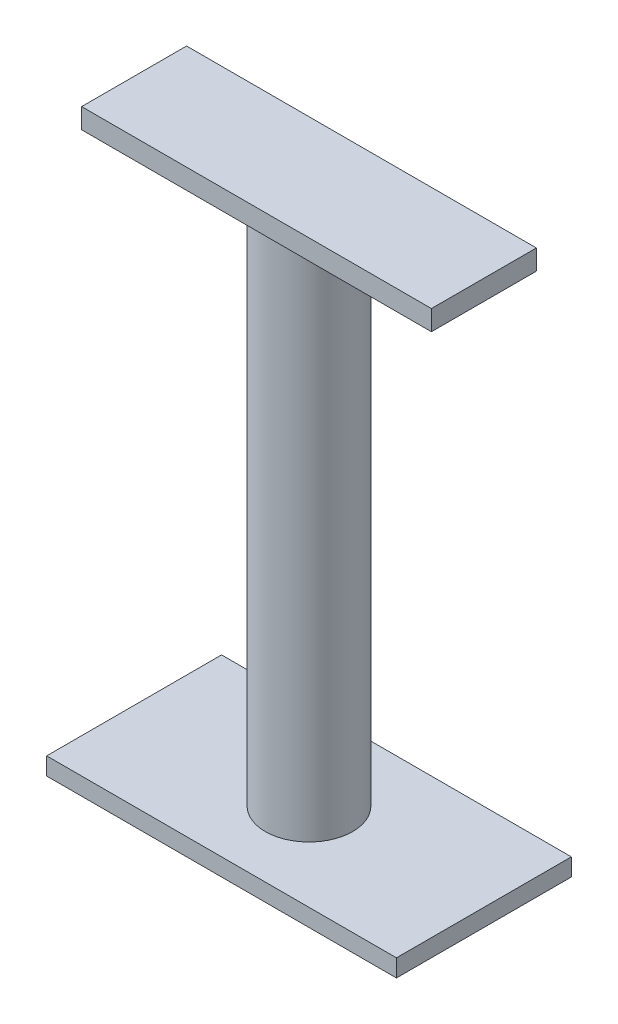
ISO-10303-21;
HEADER;
FILE_DESCRIPTION(('STEP AP214'),'2;1');
FILE_NAME('part.step','',(''),(''),'','','');
FILE_SCHEMA(('AUTOMOTIVE_DESIGN { 1 0 10303 214 1 1 1 1 }'));
ENDSEC;
DATA;
#1=APPLICATION_CONTEXT('core data for automotive mechanical design processes');
#2=APPLICATION_PROTOCOL_DEFINITION('international standard','automotive_design',2000,#1);
#3=PRODUCT_CONTEXT('',#1,'mechanical');
#4=PRODUCT('Part','Part','',(#3));
#5=PRODUCT_RELATED_PRODUCT_CATEGORY('part','',(#4));
#6=PRODUCT_DEFINITION_FORMATION('','',#4);
#7=PRODUCT_DEFINITION_CONTEXT('part definition',#1,'design');
#8=PRODUCT_DEFINITION('design','',#6,#7);
#9=PRODUCT_DEFINITION_SHAPE('','',#8);
#10=(LENGTH_UNIT() NAMED_UNIT(*) SI_UNIT(.MILLI.,.METRE.));
#11=(NAMED_UNIT(*) PLANE_ANGLE_UNIT() SI_UNIT($,.RADIAN.));
#12=(NAMED_UNIT(*) SI_UNIT($,.STERADIAN.) SOLID_ANGLE_UNIT());
#13=UNCERTAINTY_MEASURE_WITH_UNIT(LENGTH_MEASURE(1.E-05),#10,'distance_accuracy_value','');
#14=(GEOMETRIC_REPRESENTATION_CONTEXT(3) GLOBAL_UNCERTAINTY_ASSIGNED_CONTEXT((#13)) GLOBAL_UNIT_ASSIGNED_CONTEXT((#10,
#11,#12)) REPRESENTATION_CONTEXT('',''));
#15=CARTESIAN_POINT('',(0.,0.,0.));
#16=DIRECTION('',(0.,0.,1.));
#17=DIRECTION('',(1.,0.,0.));
#18=AXIS2_PLACEMENT_3D('',#15,#16,#17);
#19=CARTESIAN_POINT('',(-100.,-150.,-50.));
#20=DIRECTION('',(1.,0.,0.));
#21=DIRECTION('',(0.,0.,-1.));
#22=AXIS2_PLACEMENT_3D('',#19,#20,#21);
#23=PLANE('',#22);
#24=DIRECTION('',(0.,0.,1.));
#25=VECTOR('',#24,1.);
#26=CARTESIAN_POINT('',(-100.,-160.,-50.));
#27=LINE('',#26,#25);
#28=CARTESIAN_POINT('',(-100.,-160.,-50.));
#29=VERTEX_POINT('',#28);
#30=CARTESIAN_POINT('',(-100.,-160.,50.));
#31=VERTEX_POINT('',#30);
#32=EDGE_CURVE('E143',#29,#31,#27,.T.);
#33=ORIENTED_EDGE('',*,*,#32,.T.);
#34=DIRECTION('',(0.,-1.,0.));
#35=VECTOR('',#34,1.);
#36=CARTESIAN_POINT('',(-100.,-150.,50.));
#37=LINE('',#36,#35);
#38=CARTESIAN_POINT('',(-100.,-150.,50.));
#39=VERTEX_POINT('',#38);
#40=EDGE_CURVE('E42',#39,#31,#37,.T.);
#41=ORIENTED_EDGE('',*,*,#40,.F.);
#42=DIRECTION('',(0.,0.,1.));
#43=VECTOR('',#42,1.);
#44=CARTESIAN_POINT('',(-100.,-150.,-50.));
#45=LINE('',#44,#43);
#46=CARTESIAN_POINT('',(-100.,-150.,-50.));
#47=VERTEX_POINT('',#46);
#48=EDGE_CURVE('E149',#47,#39,#45,.T.);
#49=ORIENTED_EDGE('',*,*,#48,.F.);
#50=DIRECTION('',(0.,-1.,0.));
#51=VECTOR('',#50,1.);
#52=CARTESIAN_POINT('',(-100.,-150.,-50.));
#53=LINE('',#52,#51);
#54=EDGE_CURVE('E155',#47,#29,#53,.T.);
#55=ORIENTED_EDGE('',*,*,#54,.T.);
#56=EDGE_LOOP('',(#33,#41,#49,#55));
#57=FACE_BOUND('',#56,.T.);
#58=ADVANCED_FACE('F39',(#57),#23,.F.);
#59=CARTESIAN_POINT('',(-100.,-150.,50.));
#60=DIRECTION('',(0.,0.,-1.));
#61=DIRECTION('',(-1.,0.,0.));
#62=AXIS2_PLACEMENT_3D('',#59,#60,#61);
#63=PLANE('',#62);
#64=DIRECTION('',(1.,0.,0.));
#65=VECTOR('',#64,1.);
#66=CARTESIAN_POINT('',(-100.,-160.,50.));
#67=LINE('',#66,#65);
#68=CARTESIAN_POINT('',(100.,-160.,50.));
#69=VERTEX_POINT('',#68);
#70=EDGE_CURVE('E158',#31,#69,#67,.T.);
#71=ORIENTED_EDGE('',*,*,#70,.T.);
#72=DIRECTION('',(0.,-1.,0.));
#73=VECTOR('',#72,1.);
#74=CARTESIAN_POINT('',(100.,-150.,50.));
#75=LINE('',#74,#73);
#76=CARTESIAN_POINT('',(100.,-150.,50.));
#77=VERTEX_POINT('',#76);
#78=EDGE_CURVE('E164',#77,#69,#75,.T.);
#79=ORIENTED_EDGE('',*,*,#78,.F.);
#80=DIRECTION('',(1.,0.,0.));
#81=VECTOR('',#80,1.);
#82=CARTESIAN_POINT('',(-100.,-150.,50.));
#83=LINE('',#82,#81);
#84=EDGE_CURVE('E88',#39,#77,#83,.T.);
#85=ORIENTED_EDGE('',*,*,#84,.F.);
#86=ORIENTED_EDGE('',*,*,#40,.T.);
#87=EDGE_LOOP('',(#71,#79,#85,#86));
#88=FACE_BOUND('',#87,.T.);
#89=ADVANCED_FACE('F167',(#88),#63,.F.);
#90=CARTESIAN_POINT('',(100.,-150.,50.));
#91=DIRECTION('',(-1.,0.,0.));
#92=DIRECTION('',(0.,0.,1.));
#93=AXIS2_PLACEMENT_3D('',#90,#91,#92);
#94=PLANE('',#93);
#95=DIRECTION('',(0.,0.,-1.));
#96=VECTOR('',#95,1.);
#97=CARTESIAN_POINT('',(100.,-160.,50.));
#98=LINE('',#97,#96);
#99=CARTESIAN_POINT('',(100.,-160.,-50.));
#100=VERTEX_POINT('',#99);
#101=EDGE_CURVE('E74',#69,#100,#98,.T.);
#102=ORIENTED_EDGE('',*,*,#101,.T.);
#103=DIRECTION('',(0.,-1.,0.));
#104=VECTOR('',#103,1.);
#105=CARTESIAN_POINT('',(100.,-150.,-50.));
#106=LINE('',#105,#104);
#107=CARTESIAN_POINT('',(100.,-150.,-50.));
#108=VERTEX_POINT('',#107);
#109=EDGE_CURVE('E163',#108,#100,#106,.T.);
#110=ORIENTED_EDGE('',*,*,#109,.F.);
#111=DIRECTION('',(0.,0.,-1.));
#112=VECTOR('',#111,1.);
#113=CARTESIAN_POINT('',(100.,-150.,50.));
#114=LINE('',#113,#112);
#115=EDGE_CURVE('E152',#77,#108,#114,.T.);
#116=ORIENTED_EDGE('',*,*,#115,.F.);
#117=ORIENTED_EDGE('',*,*,#78,.T.);
#118=EDGE_LOOP('',(#102,#110,#116,#117));
#119=FACE_BOUND('',#118,.T.);
#120=ADVANCED_FACE('F192',(#119),#94,.F.);
#121=CARTESIAN_POINT('',(100.,-150.,-50.));
#122=DIRECTION('',(0.,0.,1.));
#123=DIRECTION('',(1.,0.,0.));
#124=AXIS2_PLACEMENT_3D('',#121,#122,#123);
#125=PLANE('',#124);
#126=DIRECTION('',(-1.,0.,0.));
#127=VECTOR('',#126,1.);
#128=CARTESIAN_POINT('',(100.,-160.,-50.));
#129=LINE('',#128,#127);
#130=EDGE_CURVE('E80',#100,#29,#129,.T.);
#131=ORIENTED_EDGE('',*,*,#130,.T.);
#132=ORIENTED_EDGE('',*,*,#54,.F.);
#133=DIRECTION('',(-1.,0.,0.));
#134=VECTOR('',#133,1.);
#135=CARTESIAN_POINT('',(100.,-150.,-50.));
#136=LINE('',#135,#134);
#137=EDGE_CURVE('E56',#108,#47,#136,.T.);
#138=ORIENTED_EDGE('',*,*,#137,.F.);
#139=ORIENTED_EDGE('',*,*,#109,.T.);
#140=EDGE_LOOP('',(#131,#132,#138,#139));
#141=FACE_BOUND('',#140,.T.);
#142=ADVANCED_FACE('F184',(#141),#125,.F.);
#143=CARTESIAN_POINT('',(0.,-150.,0.));
#144=DIRECTION('',(0.,1.,0.));
#145=DIRECTION('',(0.,0.,1.));
#146=AXIS2_PLACEMENT_3D('',#143,#144,#145);
#147=PLANE('',#146);
#148=CARTESIAN_POINT('',(0.,-150.,0.));
#149=DIRECTION('',(0.,1.,0.));
#150=DIRECTION('',(0.,0.,1.));
#151=AXIS2_PLACEMENT_3D('',#148,#149,#150);
#152=CIRCLE('',#151,25.);
#153=CARTESIAN_POINT('',(0.,-150.,25.));
#154=VERTEX_POINT('',#153);
#155=EDGE_CURVE('E11',#154,#154,#152,.T.);
#156=ORIENTED_EDGE('',*,*,#155,.F.);
#157=EDGE_LOOP('',(#156));
#158=FACE_BOUND('',#157,.T.);
#159=ORIENTED_EDGE('',*,*,#48,.T.);
#160=ORIENTED_EDGE('',*,*,#84,.T.);
#161=ORIENTED_EDGE('',*,*,#115,.T.);
#162=ORIENTED_EDGE('',*,*,#137,.T.);
#163=EDGE_LOOP('',(#159,#160,#161,#162));
#164=FACE_BOUND('',#163,.T.);
#165=ADVANCED_FACE('F175',(#158,#164),#147,.T.);
#166=CARTESIAN_POINT('',(0.,-160.,0.));
#167=DIRECTION('',(0.,1.,0.));
#168=DIRECTION('',(0.,0.,1.));
#169=AXIS2_PLACEMENT_3D('',#166,#167,#168);
#170=PLANE('',#169);
#171=ORIENTED_EDGE('',*,*,#32,.F.);
#172=ORIENTED_EDGE('',*,*,#130,.F.);
#173=ORIENTED_EDGE('',*,*,#101,.F.);
#174=ORIENTED_EDGE('',*,*,#70,.F.);
#175=EDGE_LOOP('',(#171,#172,#173,#174));
#176=FACE_BOUND('',#175,.T.);
#177=ADVANCED_FACE('F172',(#176),#170,.F.);
#178=CARTESIAN_POINT('',(0.,150.,0.));
#179=DIRECTION('',(0.,-1.,0.));
#180=DIRECTION('',(0.,0.,-1.));
#181=AXIS2_PLACEMENT_3D('',#178,#179,#180);
#182=CYLINDRICAL_SURFACE('',#181,25.);
#183=CARTESIAN_POINT('',(0.,150.,0.));
#184=DIRECTION('',(0.,1.,0.));
#185=DIRECTION('',(0.,0.,1.));
#186=AXIS2_PLACEMENT_3D('',#183,#184,#185);
#187=CIRCLE('',#186,25.);
#188=CARTESIAN_POINT('',(0.,150.,25.));
#189=VERTEX_POINT('',#188);
#190=EDGE_CURVE('E140',#189,#189,#187,.T.);
#191=ORIENTED_EDGE('',*,*,#190,.F.);
#192=EDGE_LOOP('',(#191));
#193=FACE_BOUND('',#192,.T.);
#194=ORIENTED_EDGE('',*,*,#155,.T.);
#195=EDGE_LOOP('',(#194));
#196=FACE_BOUND('',#195,.T.);
#197=ADVANCED_FACE('F174',(#193,#196),#182,.T.);
#198=CARTESIAN_POINT('',(-100.,161.5,-30.));
#199=DIRECTION('',(1.,0.,0.));
#200=DIRECTION('',(0.,0.,-1.));
#201=AXIS2_PLACEMENT_3D('',#198,#199,#200);
#202=PLANE('',#201);
#203=DIRECTION('',(0.,0.,1.));
#204=VECTOR('',#203,1.);
#205=CARTESIAN_POINT('',(-100.,150.,-30.));
#206=LINE('',#205,#204);
#207=CARTESIAN_POINT('',(-100.,150.,-30.));
#208=VERTEX_POINT('',#207);
#209=CARTESIAN_POINT('',(-100.,150.,30.));
#210=VERTEX_POINT('',#209);
#211=EDGE_CURVE('E139',#208,#210,#206,.T.);
#212=ORIENTED_EDGE('',*,*,#211,.T.);
#213=DIRECTION('',(0.,-1.,0.));
#214=VECTOR('',#213,1.);
#215=CARTESIAN_POINT('',(-100.,161.5,30.));
#216=LINE('',#215,#214);
#217=CARTESIAN_POINT('',(-100.,161.5,30.));
#218=VERTEX_POINT('',#217);
#219=EDGE_CURVE('E119',#218,#210,#216,.T.);
#220=ORIENTED_EDGE('',*,*,#219,.F.);
#221=DIRECTION('',(0.,0.,1.));
#222=VECTOR('',#221,1.);
#223=CARTESIAN_POINT('',(-100.,161.5,-30.));
#224=LINE('',#223,#222);
#225=CARTESIAN_POINT('',(-100.,161.5,-30.));
#226=VERTEX_POINT('',#225);
#227=EDGE_CURVE('E126',#226,#218,#224,.T.);
#228=ORIENTED_EDGE('',*,*,#227,.F.);
#229=DIRECTION('',(0.,-1.,0.));
#230=VECTOR('',#229,1.);
#231=CARTESIAN_POINT('',(-100.,161.5,-30.));
#232=LINE('',#231,#230);
#233=EDGE_CURVE('E300',#226,#208,#232,.T.);
#234=ORIENTED_EDGE('',*,*,#233,.T.);
#235=EDGE_LOOP('',(#212,#220,#228,#234));
#236=FACE_BOUND('',#235,.T.);
#237=ADVANCED_FACE('F137',(#236),#202,.F.);
#238=CARTESIAN_POINT('',(-100.,161.5,30.));
#239=DIRECTION('',(0.,0.,-1.));
#240=DIRECTION('',(-1.,0.,0.));
#241=AXIS2_PLACEMENT_3D('',#238,#239,#240);
#242=PLANE('',#241);
#243=DIRECTION('',(1.,0.,0.));
#244=VECTOR('',#243,1.);
#245=CARTESIAN_POINT('',(-100.,150.,30.));
#246=LINE('',#245,#244);
#247=CARTESIAN_POINT('',(100.,150.,30.));
#248=VERTEX_POINT('',#247);
#249=EDGE_CURVE('E291',#210,#248,#246,.T.);
#250=ORIENTED_EDGE('',*,*,#249,.T.);
#251=DIRECTION('',(0.,-1.,0.));
#252=VECTOR('',#251,1.);
#253=CARTESIAN_POINT('',(100.,161.5,30.));
#254=LINE('',#253,#252);
#255=CARTESIAN_POINT('',(100.,161.5,30.));
#256=VERTEX_POINT('',#255);
#257=EDGE_CURVE('E122',#256,#248,#254,.T.);
#258=ORIENTED_EDGE('',*,*,#257,.F.);
#259=DIRECTION('',(1.,0.,0.));
#260=VECTOR('',#259,1.);
#261=CARTESIAN_POINT('',(-100.,161.5,30.));
#262=LINE('',#261,#260);
#263=EDGE_CURVE('E115',#218,#256,#262,.T.);
#264=ORIENTED_EDGE('',*,*,#263,.F.);
#265=ORIENTED_EDGE('',*,*,#219,.T.);
#266=EDGE_LOOP('',(#250,#258,#264,#265));
#267=FACE_BOUND('',#266,.T.);
#268=ADVANCED_FACE('F117',(#267),#242,.F.);
#269=CARTESIAN_POINT('',(100.,161.5,30.));
#270=DIRECTION('',(-1.,0.,0.));
#271=DIRECTION('',(0.,0.,1.));
#272=AXIS2_PLACEMENT_3D('',#269,#270,#271);
#273=PLANE('',#272);
#274=DIRECTION('',(0.,0.,-1.));
#275=VECTOR('',#274,1.);
#276=CARTESIAN_POINT('',(100.,150.,30.));
#277=LINE('',#276,#275);
#278=CARTESIAN_POINT('',(100.,150.,-30.));
#279=VERTEX_POINT('',#278);
#280=EDGE_CURVE('E293',#248,#279,#277,.T.);
#281=ORIENTED_EDGE('',*,*,#280,.T.);
#282=DIRECTION('',(0.,-1.,0.));
#283=VECTOR('',#282,1.);
#284=CARTESIAN_POINT('',(100.,161.5,-30.));
#285=LINE('',#284,#283);
#286=CARTESIAN_POINT('',(100.,161.5,-30.));
#287=VERTEX_POINT('',#286);
#288=EDGE_CURVE('E145',#287,#279,#285,.T.);
#289=ORIENTED_EDGE('',*,*,#288,.F.);
#290=DIRECTION('',(0.,0.,-1.));
#291=VECTOR('',#290,1.);
#292=CARTESIAN_POINT('',(100.,161.5,30.));
#293=LINE('',#292,#291);
#294=EDGE_CURVE('E125',#256,#287,#293,.T.);
#295=ORIENTED_EDGE('',*,*,#294,.F.);
#296=ORIENTED_EDGE('',*,*,#257,.T.);
#297=EDGE_LOOP('',(#281,#289,#295,#296));
#298=FACE_BOUND('',#297,.T.);
#299=ADVANCED_FACE('F243',(#298),#273,.F.);
#300=CARTESIAN_POINT('',(100.,161.5,-30.));
#301=DIRECTION('',(0.,0.,1.));
#302=DIRECTION('',(1.,0.,0.));
#303=AXIS2_PLACEMENT_3D('',#300,#301,#302);
#304=PLANE('',#303);
#305=DIRECTION('',(-1.,0.,0.));
#306=VECTOR('',#305,1.);
#307=CARTESIAN_POINT('',(100.,150.,-30.));
#308=LINE('',#307,#306);
#309=EDGE_CURVE('E135',#279,#208,#308,.T.);
#310=ORIENTED_EDGE('',*,*,#309,.T.);
#311=ORIENTED_EDGE('',*,*,#233,.F.);
#312=DIRECTION('',(-1.,0.,0.));
#313=VECTOR('',#312,1.);
#314=CARTESIAN_POINT('',(100.,161.5,-30.));
#315=LINE('',#314,#313);
#316=EDGE_CURVE('E131',#287,#226,#315,.T.);
#317=ORIENTED_EDGE('',*,*,#316,.F.);
#318=ORIENTED_EDGE('',*,*,#288,.T.);
#319=EDGE_LOOP('',(#310,#311,#317,#318));
#320=FACE_BOUND('',#319,.T.);
#321=ADVANCED_FACE('F251',(#320),#304,.F.);
#322=CARTESIAN_POINT('',(0.,161.5,0.));
#323=DIRECTION('',(0.,1.,0.));
#324=DIRECTION('',(0.,0.,1.));
#325=AXIS2_PLACEMENT_3D('',#322,#323,#324);
#326=PLANE('',#325);
#327=ORIENTED_EDGE('',*,*,#227,.T.);
#328=ORIENTED_EDGE('',*,*,#263,.T.);
#329=ORIENTED_EDGE('',*,*,#294,.T.);
#330=ORIENTED_EDGE('',*,*,#316,.T.);
#331=EDGE_LOOP('',(#327,#328,#329,#330));
#332=FACE_BOUND('',#331,.T.);
#333=ADVANCED_FACE('F129',(#332),#326,.T.);
#334=CARTESIAN_POINT('',(0.,150.,0.));
#335=DIRECTION('',(0.,1.,0.));
#336=DIRECTION('',(0.,0.,1.));
#337=AXIS2_PLACEMENT_3D('',#334,#335,#336);
#338=PLANE('',#337);
#339=ORIENTED_EDGE('',*,*,#190,.T.);
#340=EDGE_LOOP('',(#339));
#341=FACE_BOUND('',#340,.T.);
#342=ORIENTED_EDGE('',*,*,#211,.F.);
#343=ORIENTED_EDGE('',*,*,#309,.F.);
#344=ORIENTED_EDGE('',*,*,#280,.F.);
#345=ORIENTED_EDGE('',*,*,#249,.F.);
#346=EDGE_LOOP('',(#342,#343,#344,#345));
#347=FACE_BOUND('',#346,.T.);
#348=ADVANCED_FACE('F268',(#341,#347),#338,.F.);
#349=CLOSED_SHELL('',(#58,#89,#120,#142,#165,#177,#197,#237,#268,#299,#321,#333,#348));
#350=MANIFOLD_SOLID_BREP('B2',#349);
#351=ADVANCED_BREP_SHAPE_REPRESENTATION('',(#18,#350),#14);
#352=SHAPE_DEFINITION_REPRESENTATION(#9,#351);
ENDSEC;
END-ISO-10303-21;
